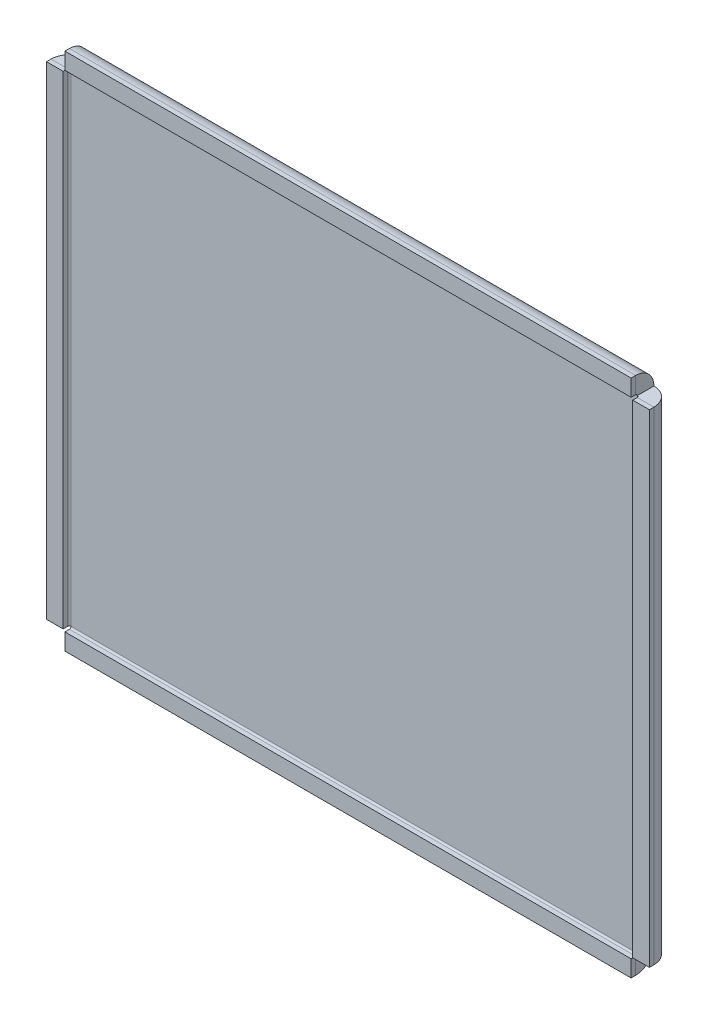
ISO-10303-21;
HEADER;
FILE_DESCRIPTION(('STEP AP214'),'2;1');
FILE_NAME('part.step','',(''),(''),'','','');
FILE_SCHEMA(('AUTOMOTIVE_DESIGN { 1 0 10303 214 1 1 1 1 }'));
ENDSEC;
DATA;
#1=APPLICATION_CONTEXT('core data for automotive mechanical design processes');
#2=APPLICATION_PROTOCOL_DEFINITION('international standard','automotive_design',2000,#1);
#3=PRODUCT_CONTEXT('',#1,'mechanical');
#4=PRODUCT('Part','Part','',(#3));
#5=PRODUCT_RELATED_PRODUCT_CATEGORY('part','',(#4));
#6=PRODUCT_DEFINITION_FORMATION('','',#4);
#7=PRODUCT_DEFINITION_CONTEXT('part definition',#1,'design');
#8=PRODUCT_DEFINITION('design','',#6,#7);
#9=PRODUCT_DEFINITION_SHAPE('','',#8);
#10=(LENGTH_UNIT() NAMED_UNIT(*) SI_UNIT(.MILLI.,.METRE.));
#11=(NAMED_UNIT(*) PLANE_ANGLE_UNIT() SI_UNIT($,.RADIAN.));
#12=(NAMED_UNIT(*) SI_UNIT($,.STERADIAN.) SOLID_ANGLE_UNIT());
#13=UNCERTAINTY_MEASURE_WITH_UNIT(LENGTH_MEASURE(1.E-05),#10,'distance_accuracy_value','');
#14=(GEOMETRIC_REPRESENTATION_CONTEXT(3) GLOBAL_UNCERTAINTY_ASSIGNED_CONTEXT((#13)) GLOBAL_UNIT_ASSIGNED_CONTEXT((#10,
#11,#12)) REPRESENTATION_CONTEXT('',''));
#15=CARTESIAN_POINT('',(0.,0.,0.));
#16=DIRECTION('',(0.,0.,1.));
#17=DIRECTION('',(1.,0.,0.));
#18=AXIS2_PLACEMENT_3D('',#15,#16,#17);
#19=CARTESIAN_POINT('',(-215.9,-184.15,12.7));
#20=DIRECTION('',(0.,0.,1.));
#21=DIRECTION('',(1.,0.,0.));
#22=AXIS2_PLACEMENT_3D('',#19,#20,#21);
#23=PLANE('',#22);
#24=DIRECTION('',(0.,-1.,0.));
#25=VECTOR('',#24,1.);
#26=CARTESIAN_POINT('',(-215.9,184.15,12.7));
#27=LINE('',#26,#25);
#28=CARTESIAN_POINT('',(-215.9,184.15,12.7));
#29=VERTEX_POINT('',#28);
#30=CARTESIAN_POINT('',(-215.9,-184.15,12.7));
#31=VERTEX_POINT('',#30);
#32=EDGE_CURVE('E437',#29,#31,#27,.T.);
#33=ORIENTED_EDGE('',*,*,#32,.T.);
#34=DIRECTION('',(1.,0.,0.));
#35=VECTOR('',#34,1.);
#36=CARTESIAN_POINT('',(-215.9,-184.15,12.7));
#37=LINE('',#36,#35);
#38=CARTESIAN_POINT('',(215.9,-184.15,12.7));
#39=VERTEX_POINT('',#38);
#40=EDGE_CURVE('E439',#31,#39,#37,.T.);
#41=ORIENTED_EDGE('',*,*,#40,.T.);
#42=DIRECTION('',(0.,1.,0.));
#43=VECTOR('',#42,1.);
#44=CARTESIAN_POINT('',(215.9,184.15,12.7));
#45=LINE('',#44,#43);
#46=CARTESIAN_POINT('',(215.9,184.15,12.7));
#47=VERTEX_POINT('',#46);
#48=EDGE_CURVE('E133',#39,#47,#45,.T.);
#49=ORIENTED_EDGE('',*,*,#48,.T.);
#50=DIRECTION('',(-1.,0.,0.));
#51=VECTOR('',#50,1.);
#52=CARTESIAN_POINT('',(-215.9,184.15,12.7));
#53=LINE('',#52,#51);
#54=EDGE_CURVE('E128',#47,#29,#53,.T.);
#55=ORIENTED_EDGE('',*,*,#54,.T.);
#56=EDGE_LOOP('',(#33,#41,#49,#55));
#57=FACE_BOUND('',#56,.T.);
#58=ADVANCED_FACE('F113',(#57),#23,.T.);
#59=CARTESIAN_POINT('',(-215.9,-184.15,0.));
#60=DIRECTION('',(0.,0.,1.));
#61=DIRECTION('',(1.,0.,0.));
#62=AXIS2_PLACEMENT_3D('',#59,#60,#61);
#63=PLANE('',#62);
#64=DIRECTION('',(0.,-1.,0.));
#65=VECTOR('',#64,1.);
#66=CARTESIAN_POINT('',(-215.9,184.15,0.));
#67=LINE('',#66,#65);
#68=CARTESIAN_POINT('',(-215.9,184.15,0.));
#69=VERTEX_POINT('',#68);
#70=CARTESIAN_POINT('',(-215.9,-184.15,0.));
#71=VERTEX_POINT('',#70);
#72=EDGE_CURVE('E255',#69,#71,#67,.T.);
#73=ORIENTED_EDGE('',*,*,#72,.F.);
#74=DIRECTION('',(-1.,0.,0.));
#75=VECTOR('',#74,1.);
#76=CARTESIAN_POINT('',(-215.9,184.15,0.));
#77=LINE('',#76,#75);
#78=CARTESIAN_POINT('',(215.9,184.15,0.));
#79=VERTEX_POINT('',#78);
#80=EDGE_CURVE('E440',#79,#69,#77,.T.);
#81=ORIENTED_EDGE('',*,*,#80,.F.);
#82=DIRECTION('',(0.,1.,0.));
#83=VECTOR('',#82,1.);
#84=CARTESIAN_POINT('',(215.9,184.15,0.));
#85=LINE('',#84,#83);
#86=CARTESIAN_POINT('',(215.9,-184.15,0.));
#87=VERTEX_POINT('',#86);
#88=EDGE_CURVE('E449',#87,#79,#85,.T.);
#89=ORIENTED_EDGE('',*,*,#88,.F.);
#90=DIRECTION('',(1.,0.,0.));
#91=VECTOR('',#90,1.);
#92=CARTESIAN_POINT('',(-215.9,-184.15,0.));
#93=LINE('',#92,#91);
#94=EDGE_CURVE('E446',#71,#87,#93,.T.);
#95=ORIENTED_EDGE('',*,*,#94,.F.);
#96=EDGE_LOOP('',(#73,#81,#89,#95));
#97=FACE_BOUND('',#96,.T.);
#98=ADVANCED_FACE('F115',(#97),#63,.F.);
#99=CARTESIAN_POINT('',(215.9,184.15,13.97));
#100=DIRECTION('',(1.,0.,0.));
#101=DIRECTION('',(0.,0.,-1.));
#102=AXIS2_PLACEMENT_3D('',#99,#100,#101);
#103=PLANE('',#102);
#104=DIRECTION('',(0.,1.,0.));
#105=VECTOR('',#104,1.);
#106=CARTESIAN_POINT('',(215.9,198.12,13.9699999999999));
#107=LINE('',#106,#105);
#108=CARTESIAN_POINT('',(215.9,185.42,13.97));
#109=VERTEX_POINT('',#108);
#110=CARTESIAN_POINT('',(215.9,198.12,13.9699999999999));
#111=VERTEX_POINT('',#110);
#112=EDGE_CURVE('E386',#109,#111,#107,.T.);
#113=ORIENTED_EDGE('',*,*,#112,.F.);
#114=CARTESIAN_POINT('',(215.9,184.15,13.97));
#115=DIRECTION('',(-1.,0.,0.));
#116=DIRECTION('',(0.,0.,1.));
#117=AXIS2_PLACEMENT_3D('',#114,#115,#116);
#118=CIRCLE('',#117,1.26999999999999);
#119=EDGE_CURVE('E432',#47,#109,#118,.F.);
#120=ORIENTED_EDGE('',*,*,#119,.F.);
#121=DIRECTION('',(0.,0.,-1.));
#122=VECTOR('',#121,1.);
#123=CARTESIAN_POINT('',(215.9,184.15,12.7));
#124=LINE('',#123,#122);
#125=EDGE_CURVE('E456',#47,#79,#124,.T.);
#126=ORIENTED_EDGE('',*,*,#125,.T.);
#127=CARTESIAN_POINT('',(215.9,184.15,13.97));
#128=DIRECTION('',(-1.,0.,0.));
#129=DIRECTION('',(0.,0.,1.));
#130=AXIS2_PLACEMENT_3D('',#127,#128,#129);
#131=CIRCLE('',#130,13.97);
#132=EDGE_CURVE('E426',#79,#111,#131,.F.);
#133=ORIENTED_EDGE('',*,*,#132,.T.);
#134=EDGE_LOOP('',(#113,#120,#126,#133));
#135=FACE_BOUND('',#134,.T.);
#136=ADVANCED_FACE('F504',(#135),#103,.T.);
#137=CARTESIAN_POINT('',(-215.9,184.15,13.97));
#138=DIRECTION('',(1.,0.,0.));
#139=DIRECTION('',(0.,0.,-1.));
#140=AXIS2_PLACEMENT_3D('',#137,#138,#139);
#141=PLANE('',#140);
#142=CARTESIAN_POINT('',(-215.9,184.15,13.97));
#143=DIRECTION('',(-1.,0.,0.));
#144=DIRECTION('',(0.,0.,1.));
#145=AXIS2_PLACEMENT_3D('',#142,#143,#144);
#146=CIRCLE('',#145,1.26999999999999);
#147=CARTESIAN_POINT('',(-215.9,185.42,13.97));
#148=VERTEX_POINT('',#147);
#149=EDGE_CURVE('E397',#148,#29,#146,.T.);
#150=ORIENTED_EDGE('',*,*,#149,.F.);
#151=DIRECTION('',(0.,1.,0.));
#152=VECTOR('',#151,1.);
#153=CARTESIAN_POINT('',(-215.9,185.42,13.97));
#154=LINE('',#153,#152);
#155=CARTESIAN_POINT('',(-215.9,198.12,13.9699999999999));
#156=VERTEX_POINT('',#155);
#157=EDGE_CURVE('E419',#148,#156,#154,.T.);
#158=ORIENTED_EDGE('',*,*,#157,.T.);
#159=CARTESIAN_POINT('',(-215.9,184.15,13.97));
#160=DIRECTION('',(-1.,0.,0.));
#161=DIRECTION('',(0.,0.,1.));
#162=AXIS2_PLACEMENT_3D('',#159,#160,#161);
#163=CIRCLE('',#162,13.97);
#164=EDGE_CURVE('E429',#156,#69,#163,.T.);
#165=ORIENTED_EDGE('',*,*,#164,.T.);
#166=DIRECTION('',(0.,0.,-1.));
#167=VECTOR('',#166,1.);
#168=CARTESIAN_POINT('',(-215.9,184.15,12.7));
#169=LINE('',#168,#167);
#170=EDGE_CURVE('E444',#29,#69,#169,.T.);
#171=ORIENTED_EDGE('',*,*,#170,.F.);
#172=EDGE_LOOP('',(#150,#158,#165,#171));
#173=FACE_BOUND('',#172,.T.);
#174=ADVANCED_FACE('F507',(#173),#141,.F.);
#175=CARTESIAN_POINT('',(-215.9,184.15,13.97));
#176=DIRECTION('',(-1.,0.,0.));
#177=DIRECTION('',(0.,1.,0.));
#178=AXIS2_PLACEMENT_3D('',#175,#176,#177);
#179=CYLINDRICAL_SURFACE('',#178,13.97);
#180=ORIENTED_EDGE('',*,*,#80,.T.);
#181=ORIENTED_EDGE('',*,*,#164,.F.);
#182=DIRECTION('',(-1.,0.,0.));
#183=VECTOR('',#182,1.);
#184=CARTESIAN_POINT('',(215.9,198.12,13.9699999999999));
#185=LINE('',#184,#183);
#186=EDGE_CURVE('E417',#156,#111,#185,.F.);
#187=ORIENTED_EDGE('',*,*,#186,.T.);
#188=ORIENTED_EDGE('',*,*,#132,.F.);
#189=EDGE_LOOP('',(#180,#181,#187,#188));
#190=FACE_BOUND('',#189,.T.);
#191=ADVANCED_FACE('F510',(#190),#179,.T.);
#192=CARTESIAN_POINT('',(-215.9,184.15,13.97));
#193=DIRECTION('',(-1.,0.,0.));
#194=DIRECTION('',(0.,1.,0.));
#195=AXIS2_PLACEMENT_3D('',#192,#193,#194);
#196=CYLINDRICAL_SURFACE('',#195,1.26999999999999);
#197=ORIENTED_EDGE('',*,*,#54,.F.);
#198=ORIENTED_EDGE('',*,*,#119,.T.);
#199=DIRECTION('',(-1.,0.,0.));
#200=VECTOR('',#199,1.);
#201=CARTESIAN_POINT('',(215.9,185.42,13.97));
#202=LINE('',#201,#200);
#203=EDGE_CURVE('E422',#109,#148,#202,.T.);
#204=ORIENTED_EDGE('',*,*,#203,.T.);
#205=ORIENTED_EDGE('',*,*,#149,.T.);
#206=EDGE_LOOP('',(#197,#198,#204,#205));
#207=FACE_BOUND('',#206,.T.);
#208=ADVANCED_FACE('F512',(#207),#196,.F.);
#209=CARTESIAN_POINT('',(-215.9,198.12,17.4244));
#210=DIRECTION('',(-1.,0.,0.));
#211=DIRECTION('',(0.,0.,1.));
#212=AXIS2_PLACEMENT_3D('',#209,#210,#211);
#213=PLANE('',#212);
#214=DIRECTION('',(0.,0.,1.));
#215=VECTOR('',#214,1.);
#216=CARTESIAN_POINT('',(-215.9,198.12,17.4244));
#217=LINE('',#216,#215);
#218=CARTESIAN_POINT('',(-215.9,198.12,17.4244));
#219=VERTEX_POINT('',#218);
#220=EDGE_CURVE('E401',#219,#156,#217,.F.);
#221=ORIENTED_EDGE('',*,*,#220,.T.);
#222=ORIENTED_EDGE('',*,*,#157,.F.);
#223=DIRECTION('',(0.,0.,-1.));
#224=VECTOR('',#223,1.);
#225=CARTESIAN_POINT('',(-215.9,185.42,12.7));
#226=LINE('',#225,#224);
#227=CARTESIAN_POINT('',(-215.9,185.42,17.4244));
#228=VERTEX_POINT('',#227);
#229=EDGE_CURVE('E409',#228,#148,#226,.T.);
#230=ORIENTED_EDGE('',*,*,#229,.F.);
#231=DIRECTION('',(0.,-1.,0.));
#232=VECTOR('',#231,1.);
#233=CARTESIAN_POINT('',(-215.9,198.12,17.4244));
#234=LINE('',#233,#232);
#235=EDGE_CURVE('E395',#219,#228,#234,.T.);
#236=ORIENTED_EDGE('',*,*,#235,.F.);
#237=EDGE_LOOP('',(#221,#222,#230,#236));
#238=FACE_BOUND('',#237,.T.);
#239=ADVANCED_FACE('F518',(#238),#213,.T.);
#240=CARTESIAN_POINT('',(215.9,198.12,12.7));
#241=DIRECTION('',(1.,0.,0.));
#242=DIRECTION('',(0.,0.,-1.));
#243=AXIS2_PLACEMENT_3D('',#240,#241,#242);
#244=PLANE('',#243);
#245=DIRECTION('',(0.,0.,1.));
#246=VECTOR('',#245,1.);
#247=CARTESIAN_POINT('',(215.9,185.42,12.7));
#248=LINE('',#247,#246);
#249=CARTESIAN_POINT('',(215.9,185.42,17.4244));
#250=VERTEX_POINT('',#249);
#251=EDGE_CURVE('E415',#109,#250,#248,.T.);
#252=ORIENTED_EDGE('',*,*,#251,.F.);
#253=ORIENTED_EDGE('',*,*,#112,.T.);
#254=DIRECTION('',(0.,0.,-1.));
#255=VECTOR('',#254,1.);
#256=CARTESIAN_POINT('',(215.9,198.12,12.7));
#257=LINE('',#256,#255);
#258=CARTESIAN_POINT('',(215.9,198.12,17.4244));
#259=VERTEX_POINT('',#258);
#260=EDGE_CURVE('E407',#111,#259,#257,.F.);
#261=ORIENTED_EDGE('',*,*,#260,.T.);
#262=DIRECTION('',(0.,-1.,0.));
#263=VECTOR('',#262,1.);
#264=CARTESIAN_POINT('',(215.9,198.12,17.4244));
#265=LINE('',#264,#263);
#266=EDGE_CURVE('E398',#259,#250,#265,.T.);
#267=ORIENTED_EDGE('',*,*,#266,.T.);
#268=EDGE_LOOP('',(#252,#253,#261,#267));
#269=FACE_BOUND('',#268,.T.);
#270=ADVANCED_FACE('F523',(#269),#244,.T.);
#271=CARTESIAN_POINT('',(-215.9,198.12,12.7));
#272=DIRECTION('',(0.,-1.,0.));
#273=DIRECTION('',(0.,0.,-1.));
#274=AXIS2_PLACEMENT_3D('',#271,#272,#273);
#275=PLANE('',#274);
#276=ORIENTED_EDGE('',*,*,#186,.F.);
#277=ORIENTED_EDGE('',*,*,#220,.F.);
#278=DIRECTION('',(1.,0.,0.));
#279=VECTOR('',#278,1.);
#280=CARTESIAN_POINT('',(215.9,198.12,17.4244));
#281=LINE('',#280,#279);
#282=EDGE_CURVE('E404',#259,#219,#281,.F.);
#283=ORIENTED_EDGE('',*,*,#282,.F.);
#284=ORIENTED_EDGE('',*,*,#260,.F.);
#285=EDGE_LOOP('',(#276,#277,#283,#284));
#286=FACE_BOUND('',#285,.T.);
#287=ADVANCED_FACE('F526',(#286),#275,.F.);
#288=CARTESIAN_POINT('',(-215.9,185.42,12.7));
#289=DIRECTION('',(0.,-1.,0.));
#290=DIRECTION('',(0.,0.,-1.));
#291=AXIS2_PLACEMENT_3D('',#288,#289,#290);
#292=PLANE('',#291);
#293=ORIENTED_EDGE('',*,*,#229,.T.);
#294=ORIENTED_EDGE('',*,*,#203,.F.);
#295=ORIENTED_EDGE('',*,*,#251,.T.);
#296=DIRECTION('',(-1.,0.,0.));
#297=VECTOR('',#296,1.);
#298=CARTESIAN_POINT('',(-215.9,185.42,17.4244));
#299=LINE('',#298,#297);
#300=EDGE_CURVE('E412',#250,#228,#299,.T.);
#301=ORIENTED_EDGE('',*,*,#300,.T.);
#302=EDGE_LOOP('',(#293,#294,#295,#301));
#303=FACE_BOUND('',#302,.T.);
#304=ADVANCED_FACE('F532',(#303),#292,.T.);
#305=CARTESIAN_POINT('',(215.9,198.12,17.4244));
#306=DIRECTION('',(0.,0.,1.));
#307=DIRECTION('',(0.,-1.,0.));
#308=AXIS2_PLACEMENT_3D('',#305,#306,#307);
#309=PLANE('',#308);
#310=ORIENTED_EDGE('',*,*,#300,.F.);
#311=ORIENTED_EDGE('',*,*,#266,.F.);
#312=ORIENTED_EDGE('',*,*,#282,.T.);
#313=ORIENTED_EDGE('',*,*,#235,.T.);
#314=EDGE_LOOP('',(#310,#311,#312,#313));
#315=FACE_BOUND('',#314,.T.);
#316=ADVANCED_FACE('F528',(#315),#309,.T.);
#317=CARTESIAN_POINT('',(-215.9,-184.15,13.97));
#318=DIRECTION('',(-1.,0.,0.));
#319=DIRECTION('',(0.,0.,1.));
#320=AXIS2_PLACEMENT_3D('',#317,#318,#319);
#321=PLANE('',#320);
#322=DIRECTION('',(0.,1.,0.));
#323=VECTOR('',#322,1.);
#324=CARTESIAN_POINT('',(-215.9,-198.12,13.9699999999999));
#325=LINE('',#324,#323);
#326=CARTESIAN_POINT('',(-215.9,-185.42,13.97));
#327=VERTEX_POINT('',#326);
#328=CARTESIAN_POINT('',(-215.9,-198.12,13.9699999999999));
#329=VERTEX_POINT('',#328);
#330=EDGE_CURVE('E344',#327,#329,#325,.F.);
#331=ORIENTED_EDGE('',*,*,#330,.F.);
#332=CARTESIAN_POINT('',(-215.9,-184.15,13.97));
#333=DIRECTION('',(1.,0.,0.));
#334=DIRECTION('',(0.,0.,-1.));
#335=AXIS2_PLACEMENT_3D('',#332,#333,#334);
#336=CIRCLE('',#335,1.26999999999999);
#337=EDGE_CURVE('E390',#31,#327,#336,.F.);
#338=ORIENTED_EDGE('',*,*,#337,.F.);
#339=DIRECTION('',(0.,0.,-1.));
#340=VECTOR('',#339,1.);
#341=CARTESIAN_POINT('',(-215.9,-184.15,12.7));
#342=LINE('',#341,#340);
#343=EDGE_CURVE('E13',#31,#71,#342,.T.);
#344=ORIENTED_EDGE('',*,*,#343,.T.);
#345=CARTESIAN_POINT('',(-215.9,-184.15,13.97));
#346=DIRECTION('',(1.,0.,0.));
#347=DIRECTION('',(0.,0.,-1.));
#348=AXIS2_PLACEMENT_3D('',#345,#346,#347);
#349=CIRCLE('',#348,13.97);
#350=EDGE_CURVE('E383',#71,#329,#349,.F.);
#351=ORIENTED_EDGE('',*,*,#350,.T.);
#352=EDGE_LOOP('',(#331,#338,#344,#351));
#353=FACE_BOUND('',#352,.T.);
#354=ADVANCED_FACE('F531',(#353),#321,.T.);
#355=CARTESIAN_POINT('',(215.9,-184.15,13.97));
#356=DIRECTION('',(-1.,0.,0.));
#357=DIRECTION('',(0.,0.,1.));
#358=AXIS2_PLACEMENT_3D('',#355,#356,#357);
#359=PLANE('',#358);
#360=CARTESIAN_POINT('',(215.9,-184.15,13.97));
#361=DIRECTION('',(1.,0.,0.));
#362=DIRECTION('',(0.,0.,-1.));
#363=AXIS2_PLACEMENT_3D('',#360,#361,#362);
#364=CIRCLE('',#363,1.26999999999999);
#365=CARTESIAN_POINT('',(215.9,-185.42,13.97));
#366=VERTEX_POINT('',#365);
#367=EDGE_CURVE('E356',#366,#39,#364,.T.);
#368=ORIENTED_EDGE('',*,*,#367,.F.);
#369=DIRECTION('',(0.,1.,0.));
#370=VECTOR('',#369,1.);
#371=CARTESIAN_POINT('',(215.9,-185.42,13.97));
#372=LINE('',#371,#370);
#373=CARTESIAN_POINT('',(215.9,-198.12,13.9699999999999));
#374=VERTEX_POINT('',#373);
#375=EDGE_CURVE('E376',#366,#374,#372,.F.);
#376=ORIENTED_EDGE('',*,*,#375,.T.);
#377=CARTESIAN_POINT('',(215.9,-184.15,13.97));
#378=DIRECTION('',(1.,0.,0.));
#379=DIRECTION('',(0.,0.,-1.));
#380=AXIS2_PLACEMENT_3D('',#377,#378,#379);
#381=CIRCLE('',#380,13.97);
#382=EDGE_CURVE('E387',#374,#87,#381,.T.);
#383=ORIENTED_EDGE('',*,*,#382,.T.);
#384=DIRECTION('',(0.,0.,-1.));
#385=VECTOR('',#384,1.);
#386=CARTESIAN_POINT('',(215.9,-184.15,12.7));
#387=LINE('',#386,#385);
#388=EDGE_CURVE('E121',#39,#87,#387,.T.);
#389=ORIENTED_EDGE('',*,*,#388,.F.);
#390=EDGE_LOOP('',(#368,#376,#383,#389));
#391=FACE_BOUND('',#390,.T.);
#392=ADVANCED_FACE('F543',(#391),#359,.F.);
#393=CARTESIAN_POINT('',(215.9,-184.15,13.97));
#394=DIRECTION('',(1.,0.,0.));
#395=DIRECTION('',(0.,-1.,0.));
#396=AXIS2_PLACEMENT_3D('',#393,#394,#395);
#397=CYLINDRICAL_SURFACE('',#396,13.97);
#398=ORIENTED_EDGE('',*,*,#94,.T.);
#399=ORIENTED_EDGE('',*,*,#382,.F.);
#400=DIRECTION('',(1.,0.,0.));
#401=VECTOR('',#400,1.);
#402=CARTESIAN_POINT('',(-215.9,-198.12,13.9699999999999));
#403=LINE('',#402,#401);
#404=EDGE_CURVE('E374',#374,#329,#403,.F.);
#405=ORIENTED_EDGE('',*,*,#404,.T.);
#406=ORIENTED_EDGE('',*,*,#350,.F.);
#407=EDGE_LOOP('',(#398,#399,#405,#406));
#408=FACE_BOUND('',#407,.T.);
#409=ADVANCED_FACE('F546',(#408),#397,.T.);
#410=CARTESIAN_POINT('',(215.9,-184.15,13.97));
#411=DIRECTION('',(1.,0.,0.));
#412=DIRECTION('',(0.,-1.,0.));
#413=AXIS2_PLACEMENT_3D('',#410,#411,#412);
#414=CYLINDRICAL_SURFACE('',#413,1.26999999999999);
#415=ORIENTED_EDGE('',*,*,#40,.F.);
#416=ORIENTED_EDGE('',*,*,#337,.T.);
#417=DIRECTION('',(1.,0.,0.));
#418=VECTOR('',#417,1.);
#419=CARTESIAN_POINT('',(-215.9,-185.42,13.97));
#420=LINE('',#419,#418);
#421=EDGE_CURVE('E379',#327,#366,#420,.T.);
#422=ORIENTED_EDGE('',*,*,#421,.T.);
#423=ORIENTED_EDGE('',*,*,#367,.T.);
#424=EDGE_LOOP('',(#415,#416,#422,#423));
#425=FACE_BOUND('',#424,.T.);
#426=ADVANCED_FACE('F547',(#425),#414,.F.);
#427=CARTESIAN_POINT('',(215.9,-198.12,17.4244));
#428=DIRECTION('',(-1.,0.,0.));
#429=DIRECTION('',(0.,0.,1.));
#430=AXIS2_PLACEMENT_3D('',#427,#428,#429);
#431=PLANE('',#430);
#432=ORIENTED_EDGE('',*,*,#375,.F.);
#433=DIRECTION('',(0.,0.,-1.));
#434=VECTOR('',#433,1.);
#435=CARTESIAN_POINT('',(215.9,-185.42,17.4244));
#436=LINE('',#435,#434);
#437=CARTESIAN_POINT('',(215.9,-185.42,17.4244));
#438=VERTEX_POINT('',#437);
#439=EDGE_CURVE('E372',#366,#438,#436,.F.);
#440=ORIENTED_EDGE('',*,*,#439,.T.);
#441=DIRECTION('',(0.,1.,0.));
#442=VECTOR('',#441,1.);
#443=CARTESIAN_POINT('',(215.9,-198.12,17.4244));
#444=LINE('',#443,#442);
#445=CARTESIAN_POINT('',(215.9,-198.12,17.4244));
#446=VERTEX_POINT('',#445);
#447=EDGE_CURVE('E353',#446,#438,#444,.T.);
#448=ORIENTED_EDGE('',*,*,#447,.F.);
#449=DIRECTION('',(0.,0.,1.));
#450=VECTOR('',#449,1.);
#451=CARTESIAN_POINT('',(215.9,-198.12,12.7));
#452=LINE('',#451,#450);
#453=EDGE_CURVE('E365',#374,#446,#452,.T.);
#454=ORIENTED_EDGE('',*,*,#453,.F.);
#455=EDGE_LOOP('',(#432,#440,#448,#454));
#456=FACE_BOUND('',#455,.T.);
#457=ADVANCED_FACE('F553',(#456),#431,.F.);
#458=CARTESIAN_POINT('',(-215.9,-198.12,12.7));
#459=DIRECTION('',(1.,0.,0.));
#460=DIRECTION('',(0.,0.,-1.));
#461=AXIS2_PLACEMENT_3D('',#458,#459,#460);
#462=PLANE('',#461);
#463=ORIENTED_EDGE('',*,*,#330,.T.);
#464=DIRECTION('',(0.,0.,-1.));
#465=VECTOR('',#464,1.);
#466=CARTESIAN_POINT('',(-215.9,-198.12,12.7));
#467=LINE('',#466,#465);
#468=CARTESIAN_POINT('',(-215.9,-198.12,17.4244));
#469=VERTEX_POINT('',#468);
#470=EDGE_CURVE('E360',#469,#329,#467,.T.);
#471=ORIENTED_EDGE('',*,*,#470,.F.);
#472=DIRECTION('',(0.,1.,0.));
#473=VECTOR('',#472,1.);
#474=CARTESIAN_POINT('',(-215.9,-198.12,17.4244));
#475=LINE('',#474,#473);
#476=CARTESIAN_POINT('',(-215.9,-185.42,17.4244));
#477=VERTEX_POINT('',#476);
#478=EDGE_CURVE('E357',#469,#477,#475,.T.);
#479=ORIENTED_EDGE('',*,*,#478,.T.);
#480=DIRECTION('',(0.,0.,1.));
#481=VECTOR('',#480,1.);
#482=CARTESIAN_POINT('',(-215.9,-185.42,12.7));
#483=LINE('',#482,#481);
#484=EDGE_CURVE('E367',#477,#327,#483,.F.);
#485=ORIENTED_EDGE('',*,*,#484,.T.);
#486=EDGE_LOOP('',(#463,#471,#479,#485));
#487=FACE_BOUND('',#486,.T.);
#488=ADVANCED_FACE('F560',(#487),#462,.F.);
#489=CARTESIAN_POINT('',(215.9,-198.12,12.7));
#490=DIRECTION('',(0.,1.,0.));
#491=DIRECTION('',(0.,0.,1.));
#492=AXIS2_PLACEMENT_3D('',#489,#490,#491);
#493=PLANE('',#492);
#494=ORIENTED_EDGE('',*,*,#404,.F.);
#495=ORIENTED_EDGE('',*,*,#453,.T.);
#496=DIRECTION('',(-1.,0.,0.));
#497=VECTOR('',#496,1.);
#498=CARTESIAN_POINT('',(215.9,-198.12,17.4244));
#499=LINE('',#498,#497);
#500=EDGE_CURVE('E363',#446,#469,#499,.T.);
#501=ORIENTED_EDGE('',*,*,#500,.T.);
#502=ORIENTED_EDGE('',*,*,#470,.T.);
#503=EDGE_LOOP('',(#494,#495,#501,#502));
#504=FACE_BOUND('',#503,.T.);
#505=ADVANCED_FACE('F569',(#504),#493,.F.);
#506=CARTESIAN_POINT('',(215.9,-185.42,12.7));
#507=DIRECTION('',(0.,1.,0.));
#508=DIRECTION('',(0.,0.,1.));
#509=AXIS2_PLACEMENT_3D('',#506,#507,#508);
#510=PLANE('',#509);
#511=ORIENTED_EDGE('',*,*,#439,.F.);
#512=ORIENTED_EDGE('',*,*,#421,.F.);
#513=ORIENTED_EDGE('',*,*,#484,.F.);
#514=DIRECTION('',(1.,0.,0.));
#515=VECTOR('',#514,1.);
#516=CARTESIAN_POINT('',(-215.9,-185.42,17.4244));
#517=LINE('',#516,#515);
#518=EDGE_CURVE('E370',#438,#477,#517,.F.);
#519=ORIENTED_EDGE('',*,*,#518,.F.);
#520=EDGE_LOOP('',(#511,#512,#513,#519));
#521=FACE_BOUND('',#520,.T.);
#522=ADVANCED_FACE('F565',(#521),#510,.T.);
#523=CARTESIAN_POINT('',(-215.9,-198.12,17.4244));
#524=DIRECTION('',(0.,0.,-1.));
#525=DIRECTION('',(0.,1.,0.));
#526=AXIS2_PLACEMENT_3D('',#523,#524,#525);
#527=PLANE('',#526);
#528=ORIENTED_EDGE('',*,*,#518,.T.);
#529=ORIENTED_EDGE('',*,*,#478,.F.);
#530=ORIENTED_EDGE('',*,*,#500,.F.);
#531=ORIENTED_EDGE('',*,*,#447,.T.);
#532=EDGE_LOOP('',(#528,#529,#530,#531));
#533=FACE_BOUND('',#532,.T.);
#534=ADVANCED_FACE('F562',(#533),#527,.F.);
#535=CARTESIAN_POINT('',(215.9,-184.15,13.97));
#536=DIRECTION('',(0.,-1.,0.));
#537=DIRECTION('',(0.,0.,-1.));
#538=AXIS2_PLACEMENT_3D('',#535,#536,#537);
#539=PLANE('',#538);
#540=DIRECTION('',(1.,0.,0.));
#541=VECTOR('',#540,1.);
#542=CARTESIAN_POINT('',(229.87,-184.15,13.9699999999999));
#543=LINE('',#542,#541);
#544=CARTESIAN_POINT('',(217.17,-184.15,13.97));
#545=VERTEX_POINT('',#544);
#546=CARTESIAN_POINT('',(229.87,-184.15,13.9699999999999));
#547=VERTEX_POINT('',#546);
#548=EDGE_CURVE('E304',#545,#547,#543,.T.);
#549=ORIENTED_EDGE('',*,*,#548,.F.);
#550=CARTESIAN_POINT('',(215.9,-184.15,13.97));
#551=DIRECTION('',(0.,1.,0.));
#552=DIRECTION('',(0.,0.,1.));
#553=AXIS2_PLACEMENT_3D('',#550,#551,#552);
#554=CIRCLE('',#553,1.26999999999999);
#555=EDGE_CURVE('E348',#39,#545,#554,.F.);
#556=ORIENTED_EDGE('',*,*,#555,.F.);
#557=ORIENTED_EDGE('',*,*,#388,.T.);
#558=CARTESIAN_POINT('',(215.9,-184.15,13.97));
#559=DIRECTION('',(0.,1.,0.));
#560=DIRECTION('',(0.,0.,1.));
#561=AXIS2_PLACEMENT_3D('',#558,#559,#560);
#562=CIRCLE('',#561,13.97);
#563=EDGE_CURVE('E341',#87,#547,#562,.F.);
#564=ORIENTED_EDGE('',*,*,#563,.T.);
#565=EDGE_LOOP('',(#549,#556,#557,#564));
#566=FACE_BOUND('',#565,.T.);
#567=ADVANCED_FACE('F463',(#566),#539,.T.);
#568=CARTESIAN_POINT('',(215.9,184.15,13.97));
#569=DIRECTION('',(0.,-1.,0.));
#570=DIRECTION('',(0.,0.,-1.));
#571=AXIS2_PLACEMENT_3D('',#568,#569,#570);
#572=PLANE('',#571);
#573=CARTESIAN_POINT('',(215.9,184.15,13.97));
#574=DIRECTION('',(0.,1.,0.));
#575=DIRECTION('',(0.,0.,1.));
#576=AXIS2_PLACEMENT_3D('',#573,#574,#575);
#577=CIRCLE('',#576,1.26999999999999);
#578=CARTESIAN_POINT('',(217.17,184.15,13.97));
#579=VERTEX_POINT('',#578);
#580=EDGE_CURVE('E311',#579,#47,#577,.T.);
#581=ORIENTED_EDGE('',*,*,#580,.F.);
#582=DIRECTION('',(1.,0.,0.));
#583=VECTOR('',#582,1.);
#584=CARTESIAN_POINT('',(217.17,184.15,13.97));
#585=LINE('',#584,#583);
#586=CARTESIAN_POINT('',(229.87,184.15,13.9699999999999));
#587=VERTEX_POINT('',#586);
#588=EDGE_CURVE('E334',#579,#587,#585,.T.);
#589=ORIENTED_EDGE('',*,*,#588,.T.);
#590=CARTESIAN_POINT('',(215.9,184.15,13.97));
#591=DIRECTION('',(0.,1.,0.));
#592=DIRECTION('',(0.,0.,1.));
#593=AXIS2_PLACEMENT_3D('',#590,#591,#592);
#594=CIRCLE('',#593,13.97);
#595=EDGE_CURVE('E345',#587,#79,#594,.T.);
#596=ORIENTED_EDGE('',*,*,#595,.T.);
#597=ORIENTED_EDGE('',*,*,#125,.F.);
#598=EDGE_LOOP('',(#581,#589,#596,#597));
#599=FACE_BOUND('',#598,.T.);
#600=ADVANCED_FACE('F577',(#599),#572,.F.);
#601=CARTESIAN_POINT('',(215.9,184.15,13.97));
#602=DIRECTION('',(0.,1.,0.));
#603=DIRECTION('',(1.,0.,0.));
#604=AXIS2_PLACEMENT_3D('',#601,#602,#603);
#605=CYLINDRICAL_SURFACE('',#604,13.97);
#606=ORIENTED_EDGE('',*,*,#88,.T.);
#607=ORIENTED_EDGE('',*,*,#595,.F.);
#608=DIRECTION('',(0.,1.,0.));
#609=VECTOR('',#608,1.);
#610=CARTESIAN_POINT('',(229.87,184.15,13.9699999999999));
#611=LINE('',#610,#609);
#612=EDGE_CURVE('E331',#547,#587,#611,.T.);
#613=ORIENTED_EDGE('',*,*,#612,.F.);
#614=ORIENTED_EDGE('',*,*,#563,.F.);
#615=EDGE_LOOP('',(#606,#607,#613,#614));
#616=FACE_BOUND('',#615,.T.);
#617=ADVANCED_FACE('F467',(#616),#605,.T.);
#618=CARTESIAN_POINT('',(215.9,184.15,13.97));
#619=DIRECTION('',(0.,1.,0.));
#620=DIRECTION('',(1.,0.,0.));
#621=AXIS2_PLACEMENT_3D('',#618,#619,#620);
#622=CYLINDRICAL_SURFACE('',#621,1.26999999999999);
#623=ORIENTED_EDGE('',*,*,#48,.F.);
#624=ORIENTED_EDGE('',*,*,#555,.T.);
#625=DIRECTION('',(0.,-1.,0.));
#626=VECTOR('',#625,1.);
#627=CARTESIAN_POINT('',(217.17,-184.15,13.97));
#628=LINE('',#627,#626);
#629=EDGE_CURVE('E337',#545,#579,#628,.F.);
#630=ORIENTED_EDGE('',*,*,#629,.T.);
#631=ORIENTED_EDGE('',*,*,#580,.T.);
#632=EDGE_LOOP('',(#623,#624,#630,#631));
#633=FACE_BOUND('',#632,.T.);
#634=ADVANCED_FACE('F486',(#633),#622,.F.);
#635=CARTESIAN_POINT('',(229.87,184.15,12.7));
#636=DIRECTION('',(0.,1.,0.));
#637=DIRECTION('',(0.,0.,1.));
#638=AXIS2_PLACEMENT_3D('',#635,#636,#637);
#639=PLANE('',#638);
#640=DIRECTION('',(0.,0.,-1.));
#641=VECTOR('',#640,1.);
#642=CARTESIAN_POINT('',(229.87,184.15,12.7));
#643=LINE('',#642,#641);
#644=CARTESIAN_POINT('',(229.87,184.15,17.4244));
#645=VERTEX_POINT('',#644);
#646=EDGE_CURVE('E315',#645,#587,#643,.T.);
#647=ORIENTED_EDGE('',*,*,#646,.T.);
#648=ORIENTED_EDGE('',*,*,#588,.F.);
#649=DIRECTION('',(0.,0.,1.));
#650=VECTOR('',#649,1.);
#651=CARTESIAN_POINT('',(217.17,184.15,12.7));
#652=LINE('',#651,#650);
#653=CARTESIAN_POINT('',(217.17,184.15,17.4244));
#654=VERTEX_POINT('',#653);
#655=EDGE_CURVE('E323',#654,#579,#652,.F.);
#656=ORIENTED_EDGE('',*,*,#655,.F.);
#657=DIRECTION('',(-1.,0.,0.));
#658=VECTOR('',#657,1.);
#659=CARTESIAN_POINT('',(229.87,184.15,17.4244));
#660=LINE('',#659,#658);
#661=EDGE_CURVE('E309',#645,#654,#660,.T.);
#662=ORIENTED_EDGE('',*,*,#661,.F.);
#663=EDGE_LOOP('',(#647,#648,#656,#662));
#664=FACE_BOUND('',#663,.T.);
#665=ADVANCED_FACE('F475',(#664),#639,.T.);
#666=CARTESIAN_POINT('',(229.87,-184.15,17.4244));
#667=DIRECTION('',(0.,-1.,0.));
#668=DIRECTION('',(0.,0.,-1.));
#669=AXIS2_PLACEMENT_3D('',#666,#667,#668);
#670=PLANE('',#669);
#671=DIRECTION('',(0.,0.,-1.));
#672=VECTOR('',#671,1.);
#673=CARTESIAN_POINT('',(217.17,-184.15,12.6999999999978));
#674=LINE('',#673,#672);
#675=CARTESIAN_POINT('',(217.17,-184.15,17.4244));
#676=VERTEX_POINT('',#675);
#677=EDGE_CURVE('E329',#545,#676,#674,.F.);
#678=ORIENTED_EDGE('',*,*,#677,.F.);
#679=ORIENTED_EDGE('',*,*,#548,.T.);
#680=DIRECTION('',(0.,0.,1.));
#681=VECTOR('',#680,1.);
#682=CARTESIAN_POINT('',(229.87,-184.15,17.4244));
#683=LINE('',#682,#681);
#684=CARTESIAN_POINT('',(229.87,-184.15,17.4244));
#685=VERTEX_POINT('',#684);
#686=EDGE_CURVE('E321',#547,#685,#683,.T.);
#687=ORIENTED_EDGE('',*,*,#686,.T.);
#688=DIRECTION('',(-1.,0.,0.));
#689=VECTOR('',#688,1.);
#690=CARTESIAN_POINT('',(229.87,-184.15,17.4244));
#691=LINE('',#690,#689);
#692=EDGE_CURVE('E312',#685,#676,#691,.T.);
#693=ORIENTED_EDGE('',*,*,#692,.T.);
#694=EDGE_LOOP('',(#678,#679,#687,#693));
#695=FACE_BOUND('',#694,.T.);
#696=ADVANCED_FACE('F483',(#695),#670,.T.);
#697=CARTESIAN_POINT('',(229.87,184.15,12.7));
#698=DIRECTION('',(1.,0.,0.));
#699=DIRECTION('',(0.,0.,-1.));
#700=AXIS2_PLACEMENT_3D('',#697,#698,#699);
#701=PLANE('',#700);
#702=ORIENTED_EDGE('',*,*,#686,.F.);
#703=ORIENTED_EDGE('',*,*,#612,.T.);
#704=ORIENTED_EDGE('',*,*,#646,.F.);
#705=DIRECTION('',(0.,1.,0.));
#706=VECTOR('',#705,1.);
#707=CARTESIAN_POINT('',(229.87,184.15,17.4244));
#708=LINE('',#707,#706);
#709=EDGE_CURVE('E318',#685,#645,#708,.T.);
#710=ORIENTED_EDGE('',*,*,#709,.F.);
#711=EDGE_LOOP('',(#702,#703,#704,#710));
#712=FACE_BOUND('',#711,.T.);
#713=ADVANCED_FACE('F471',(#712),#701,.T.);
#714=CARTESIAN_POINT('',(217.17,184.15,12.7));
#715=DIRECTION('',(1.,0.,0.));
#716=DIRECTION('',(0.,0.,-1.));
#717=AXIS2_PLACEMENT_3D('',#714,#715,#716);
#718=PLANE('',#717);
#719=ORIENTED_EDGE('',*,*,#629,.F.);
#720=ORIENTED_EDGE('',*,*,#677,.T.);
#721=DIRECTION('',(0.,-1.,0.));
#722=VECTOR('',#721,1.);
#723=CARTESIAN_POINT('',(217.17,184.15,17.4244));
#724=LINE('',#723,#722);
#725=EDGE_CURVE('E326',#676,#654,#724,.F.);
#726=ORIENTED_EDGE('',*,*,#725,.T.);
#727=ORIENTED_EDGE('',*,*,#655,.T.);
#728=EDGE_LOOP('',(#719,#720,#726,#727));
#729=FACE_BOUND('',#728,.T.);
#730=ADVANCED_FACE('F489',(#729),#718,.F.);
#731=CARTESIAN_POINT('',(229.87,184.15,17.4244));
#732=DIRECTION('',(0.,0.,1.));
#733=DIRECTION('',(1.,0.,0.));
#734=AXIS2_PLACEMENT_3D('',#731,#732,#733);
#735=PLANE('',#734);
#736=ORIENTED_EDGE('',*,*,#725,.F.);
#737=ORIENTED_EDGE('',*,*,#692,.F.);
#738=ORIENTED_EDGE('',*,*,#709,.T.);
#739=ORIENTED_EDGE('',*,*,#661,.T.);
#740=EDGE_LOOP('',(#736,#737,#738,#739));
#741=FACE_BOUND('',#740,.T.);
#742=ADVANCED_FACE('F480',(#741),#735,.T.);
#743=CARTESIAN_POINT('',(-215.9,184.15,13.97));
#744=DIRECTION('',(0.,1.,0.));
#745=DIRECTION('',(0.,0.,1.));
#746=AXIS2_PLACEMENT_3D('',#743,#744,#745);
#747=PLANE('',#746);
#748=DIRECTION('',(-1.,0.,0.));
#749=VECTOR('',#748,1.);
#750=CARTESIAN_POINT('',(-229.87,184.15,13.9699999999999));
#751=LINE('',#750,#749);
#752=CARTESIAN_POINT('',(-217.17,184.15,13.97));
#753=VERTEX_POINT('',#752);
#754=CARTESIAN_POINT('',(-229.87,184.15,13.9699999999999));
#755=VERTEX_POINT('',#754);
#756=EDGE_CURVE('E301',#753,#755,#751,.T.);
#757=ORIENTED_EDGE('',*,*,#756,.F.);
#758=CARTESIAN_POINT('',(-215.9,184.15,13.97));
#759=DIRECTION('',(0.,-1.,0.));
#760=DIRECTION('',(0.,0.,-1.));
#761=AXIS2_PLACEMENT_3D('',#758,#759,#760);
#762=CIRCLE('',#761,1.26999999999999);
#763=EDGE_CURVE('E259',#29,#753,#762,.F.);
#764=ORIENTED_EDGE('',*,*,#763,.F.);
#765=ORIENTED_EDGE('',*,*,#170,.T.);
#766=CARTESIAN_POINT('',(-215.9,184.15,13.97));
#767=DIRECTION('',(0.,-1.,0.));
#768=DIRECTION('',(0.,0.,-1.));
#769=AXIS2_PLACEMENT_3D('',#766,#767,#768);
#770=CIRCLE('',#769,13.97);
#771=EDGE_CURVE('E258',#69,#755,#770,.F.);
#772=ORIENTED_EDGE('',*,*,#771,.T.);
#773=EDGE_LOOP('',(#757,#764,#765,#772));
#774=FACE_BOUND('',#773,.T.);
#775=ADVANCED_FACE('F496',(#774),#747,.T.);
#776=CARTESIAN_POINT('',(-215.9,-184.15,13.97));
#777=DIRECTION('',(0.,1.,0.));
#778=DIRECTION('',(0.,0.,1.));
#779=AXIS2_PLACEMENT_3D('',#776,#777,#778);
#780=PLANE('',#779);
#781=CARTESIAN_POINT('',(-215.9,-184.15,13.97));
#782=DIRECTION('',(0.,-1.,0.));
#783=DIRECTION('',(0.,0.,-1.));
#784=AXIS2_PLACEMENT_3D('',#781,#782,#783);
#785=CIRCLE('',#784,1.26999999999999);
#786=CARTESIAN_POINT('',(-217.17,-184.15,13.97));
#787=VERTEX_POINT('',#786);
#788=EDGE_CURVE('E266',#787,#31,#785,.T.);
#789=ORIENTED_EDGE('',*,*,#788,.F.);
#790=DIRECTION('',(-1.,0.,0.));
#791=VECTOR('',#790,1.);
#792=CARTESIAN_POINT('',(-217.17,-184.15,13.97));
#793=LINE('',#792,#791);
#794=CARTESIAN_POINT('',(-229.87,-184.15,13.9699999999999));
#795=VERTEX_POINT('',#794);
#796=EDGE_CURVE('E263',#787,#795,#793,.T.);
#797=ORIENTED_EDGE('',*,*,#796,.T.);
#798=CARTESIAN_POINT('',(-215.9,-184.15,13.97));
#799=DIRECTION('',(0.,-1.,0.));
#800=DIRECTION('',(0.,0.,-1.));
#801=AXIS2_PLACEMENT_3D('',#798,#799,#800);
#802=CIRCLE('',#801,13.97);
#803=EDGE_CURVE('E248',#795,#71,#802,.T.);
#804=ORIENTED_EDGE('',*,*,#803,.T.);
#805=ORIENTED_EDGE('',*,*,#343,.F.);
#806=EDGE_LOOP('',(#789,#797,#804,#805));
#807=FACE_BOUND('',#806,.T.);
#808=ADVANCED_FACE('F264',(#807),#780,.F.);
#809=CARTESIAN_POINT('',(-215.9,-184.15,13.97));
#810=DIRECTION('',(0.,-1.,0.));
#811=DIRECTION('',(-1.,0.,0.));
#812=AXIS2_PLACEMENT_3D('',#809,#810,#811);
#813=CYLINDRICAL_SURFACE('',#812,13.97);
#814=ORIENTED_EDGE('',*,*,#72,.T.);
#815=ORIENTED_EDGE('',*,*,#803,.F.);
#816=DIRECTION('',(0.,-1.,0.));
#817=VECTOR('',#816,1.);
#818=CARTESIAN_POINT('',(-229.87,-184.15,13.9699999999999));
#819=LINE('',#818,#817);
#820=EDGE_CURVE('E253',#755,#795,#819,.T.);
#821=ORIENTED_EDGE('',*,*,#820,.F.);
#822=ORIENTED_EDGE('',*,*,#771,.F.);
#823=EDGE_LOOP('',(#814,#815,#821,#822));
#824=FACE_BOUND('',#823,.T.);
#825=ADVANCED_FACE('F250',(#824),#813,.T.);
#826=CARTESIAN_POINT('',(-215.9,-184.15,13.97));
#827=DIRECTION('',(0.,-1.,0.));
#828=DIRECTION('',(-1.,0.,0.));
#829=AXIS2_PLACEMENT_3D('',#826,#827,#828);
#830=CYLINDRICAL_SURFACE('',#829,1.26999999999999);
#831=ORIENTED_EDGE('',*,*,#32,.F.);
#832=ORIENTED_EDGE('',*,*,#763,.T.);
#833=DIRECTION('',(0.,1.,0.));
#834=VECTOR('',#833,1.);
#835=CARTESIAN_POINT('',(-217.17,184.15,13.97));
#836=LINE('',#835,#834);
#837=EDGE_CURVE('E271',#753,#787,#836,.F.);
#838=ORIENTED_EDGE('',*,*,#837,.T.);
#839=ORIENTED_EDGE('',*,*,#788,.T.);
#840=EDGE_LOOP('',(#831,#832,#838,#839));
#841=FACE_BOUND('',#840,.T.);
#842=ADVANCED_FACE('F687',(#841),#830,.F.);
#843=CARTESIAN_POINT('',(-229.87,-184.15,12.7));
#844=DIRECTION('',(0.,-1.,0.));
#845=DIRECTION('',(0.,0.,-1.));
#846=AXIS2_PLACEMENT_3D('',#843,#844,#845);
#847=PLANE('',#846);
#848=DIRECTION('',(0.,0.,-1.));
#849=VECTOR('',#848,1.);
#850=CARTESIAN_POINT('',(-229.87,-184.15,12.7));
#851=LINE('',#850,#849);
#852=CARTESIAN_POINT('',(-229.87,-184.15,17.4244));
#853=VERTEX_POINT('',#852);
#854=EDGE_CURVE('E278',#853,#795,#851,.T.);
#855=ORIENTED_EDGE('',*,*,#854,.T.);
#856=ORIENTED_EDGE('',*,*,#796,.F.);
#857=DIRECTION('',(0.,0.,1.));
#858=VECTOR('',#857,1.);
#859=CARTESIAN_POINT('',(-217.17,-184.15,12.7));
#860=LINE('',#859,#858);
#861=CARTESIAN_POINT('',(-217.17,-184.15,17.4244));
#862=VERTEX_POINT('',#861);
#863=EDGE_CURVE('E294',#862,#787,#860,.F.);
#864=ORIENTED_EDGE('',*,*,#863,.F.);
#865=DIRECTION('',(1.,0.,0.));
#866=VECTOR('',#865,1.);
#867=CARTESIAN_POINT('',(-229.87,-184.15,17.4244));
#868=LINE('',#867,#866);
#869=EDGE_CURVE('E283',#853,#862,#868,.T.);
#870=ORIENTED_EDGE('',*,*,#869,.F.);
#871=EDGE_LOOP('',(#855,#856,#864,#870));
#872=FACE_BOUND('',#871,.T.);
#873=ADVANCED_FACE('F282',(#872),#847,.T.);
#874=CARTESIAN_POINT('',(-229.87,184.15,17.4244));
#875=DIRECTION('',(0.,1.,0.));
#876=DIRECTION('',(0.,0.,1.));
#877=AXIS2_PLACEMENT_3D('',#874,#875,#876);
#878=PLANE('',#877);
#879=DIRECTION('',(0.,0.,-1.));
#880=VECTOR('',#879,1.);
#881=CARTESIAN_POINT('',(-217.17,184.15,12.7));
#882=LINE('',#881,#880);
#883=CARTESIAN_POINT('',(-217.17,184.15,17.4244));
#884=VERTEX_POINT('',#883);
#885=EDGE_CURVE('E280',#753,#884,#882,.F.);
#886=ORIENTED_EDGE('',*,*,#885,.F.);
#887=ORIENTED_EDGE('',*,*,#756,.T.);
#888=DIRECTION('',(0.,0.,1.));
#889=VECTOR('',#888,1.);
#890=CARTESIAN_POINT('',(-229.87,184.15,17.4244));
#891=LINE('',#890,#889);
#892=CARTESIAN_POINT('',(-229.87,184.15,17.4244));
#893=VERTEX_POINT('',#892);
#894=EDGE_CURVE('E279',#755,#893,#891,.T.);
#895=ORIENTED_EDGE('',*,*,#894,.T.);
#896=DIRECTION('',(1.,0.,0.));
#897=VECTOR('',#896,1.);
#898=CARTESIAN_POINT('',(-229.87,184.15,17.4244));
#899=LINE('',#898,#897);
#900=EDGE_CURVE('E285',#893,#884,#899,.T.);
#901=ORIENTED_EDGE('',*,*,#900,.T.);
#902=EDGE_LOOP('',(#886,#887,#895,#901));
#903=FACE_BOUND('',#902,.T.);
#904=ADVANCED_FACE('F715',(#903),#878,.T.);
#905=CARTESIAN_POINT('',(-229.87,-184.15,12.7));
#906=DIRECTION('',(-1.,0.,0.));
#907=DIRECTION('',(0.,0.,1.));
#908=AXIS2_PLACEMENT_3D('',#905,#906,#907);
#909=PLANE('',#908);
#910=ORIENTED_EDGE('',*,*,#894,.F.);
#911=ORIENTED_EDGE('',*,*,#820,.T.);
#912=ORIENTED_EDGE('',*,*,#854,.F.);
#913=DIRECTION('',(0.,-1.,0.));
#914=VECTOR('',#913,1.);
#915=CARTESIAN_POINT('',(-229.87,-184.15,17.4244));
#916=LINE('',#915,#914);
#917=EDGE_CURVE('E286',#893,#853,#916,.T.);
#918=ORIENTED_EDGE('',*,*,#917,.F.);
#919=EDGE_LOOP('',(#910,#911,#912,#918));
#920=FACE_BOUND('',#919,.T.);
#921=ADVANCED_FACE('F276',(#920),#909,.T.);
#922=CARTESIAN_POINT('',(-217.17,-184.15,12.7));
#923=DIRECTION('',(-1.,0.,0.));
#924=DIRECTION('',(0.,0.,1.));
#925=AXIS2_PLACEMENT_3D('',#922,#923,#924);
#926=PLANE('',#925);
#927=ORIENTED_EDGE('',*,*,#837,.F.);
#928=ORIENTED_EDGE('',*,*,#885,.T.);
#929=DIRECTION('',(0.,1.,0.));
#930=VECTOR('',#929,1.);
#931=CARTESIAN_POINT('',(-217.17,-184.15,17.4244));
#932=LINE('',#931,#930);
#933=EDGE_CURVE('E296',#884,#862,#932,.F.);
#934=ORIENTED_EDGE('',*,*,#933,.T.);
#935=ORIENTED_EDGE('',*,*,#863,.T.);
#936=EDGE_LOOP('',(#927,#928,#934,#935));
#937=FACE_BOUND('',#936,.T.);
#938=ADVANCED_FACE('F735',(#937),#926,.F.);
#939=CARTESIAN_POINT('',(-229.87,-184.15,17.4244));
#940=DIRECTION('',(0.,0.,1.));
#941=DIRECTION('',(1.,0.,0.));
#942=AXIS2_PLACEMENT_3D('',#939,#940,#941);
#943=PLANE('',#942);
#944=ORIENTED_EDGE('',*,*,#933,.F.);
#945=ORIENTED_EDGE('',*,*,#900,.F.);
#946=ORIENTED_EDGE('',*,*,#917,.T.);
#947=ORIENTED_EDGE('',*,*,#869,.T.);
#948=EDGE_LOOP('',(#944,#945,#946,#947));
#949=FACE_BOUND('',#948,.T.);
#950=ADVANCED_FACE('F745',(#949),#943,.T.);
#951=CLOSED_SHELL('',(#58,#98,#136,#174,#191,#208,#239,#270,#287,#304,#316,#354,#392,#409,#426,
#457,#488,#505,#522,#534,#567,#600,#617,#634,#665,#696,#713,#730,#742,#775,#808,#825,#842,#873,
#904,#921,#938,#950));
#952=MANIFOLD_SOLID_BREP('B2',#951);
#953=ADVANCED_BREP_SHAPE_REPRESENTATION('',(#18,#952),#14);
#954=SHAPE_DEFINITION_REPRESENTATION(#9,#953);
ENDSEC;
END-ISO-10303-21;
